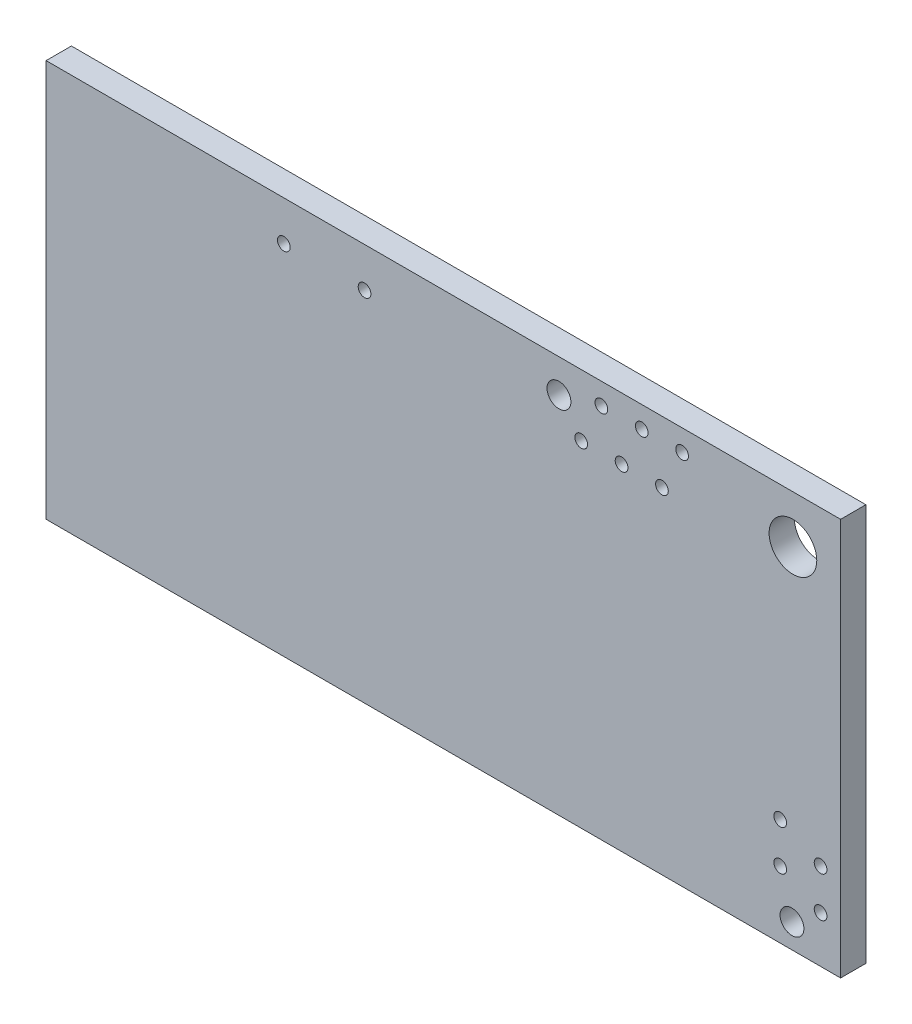
ISO-10303-21;
HEADER;
FILE_DESCRIPTION(('STEP AP214'),'2;1');
FILE_NAME('part.step','',(''),(''),'','','');
FILE_SCHEMA(('AUTOMOTIVE_DESIGN { 1 0 10303 214 1 1 1 1 }'));
ENDSEC;
DATA;
#1=APPLICATION_CONTEXT('core data for automotive mechanical design processes');
#2=APPLICATION_PROTOCOL_DEFINITION('international standard','automotive_design',2000,#1);
#3=PRODUCT_CONTEXT('',#1,'mechanical');
#4=PRODUCT('Part','Part','',(#3));
#5=PRODUCT_RELATED_PRODUCT_CATEGORY('part','',(#4));
#6=PRODUCT_DEFINITION_FORMATION('','',#4);
#7=PRODUCT_DEFINITION_CONTEXT('part definition',#1,'design');
#8=PRODUCT_DEFINITION('design','',#6,#7);
#9=PRODUCT_DEFINITION_SHAPE('','',#8);
#10=(LENGTH_UNIT() NAMED_UNIT(*) SI_UNIT(.MILLI.,.METRE.));
#11=(NAMED_UNIT(*) PLANE_ANGLE_UNIT() SI_UNIT($,.RADIAN.));
#12=(NAMED_UNIT(*) SI_UNIT($,.STERADIAN.) SOLID_ANGLE_UNIT());
#13=UNCERTAINTY_MEASURE_WITH_UNIT(LENGTH_MEASURE(1.E-05),#10,'distance_accuracy_value','');
#14=(GEOMETRIC_REPRESENTATION_CONTEXT(3) GLOBAL_UNCERTAINTY_ASSIGNED_CONTEXT((#13)) GLOBAL_UNIT_ASSIGNED_CONTEXT((#10,
#11,#12)) REPRESENTATION_CONTEXT('',''));
#15=CARTESIAN_POINT('',(0.,0.,0.));
#16=DIRECTION('',(0.,0.,1.));
#17=DIRECTION('',(1.,0.,0.));
#18=AXIS2_PLACEMENT_3D('',#15,#16,#17);
#19=CARTESIAN_POINT('',(0.,0.,-1.59143954));
#20=DIRECTION('',(0.,1.,0.));
#21=DIRECTION('',(1.,0.,0.));
#22=AXIS2_PLACEMENT_3D('',#19,#20,#21);
#23=PLANE('',#22);
#24=DIRECTION('',(1.,0.,0.));
#25=VECTOR('',#24,1.);
#26=CARTESIAN_POINT('',(0.,0.,-1.59143954));
#27=LINE('',#26,#25);
#28=CARTESIAN_POINT('',(0.,0.,-1.59143954));
#29=VERTEX_POINT('',#28);
#30=CARTESIAN_POINT('',(50.,0.,-1.59143954));
#31=VERTEX_POINT('',#30);
#32=EDGE_CURVE('E12',#29,#31,#27,.T.);
#33=ORIENTED_EDGE('',*,*,#32,.T.);
#34=DIRECTION('',(0.,0.,1.));
#35=VECTOR('',#34,1.);
#36=CARTESIAN_POINT('',(50.,0.,-1.59143954));
#37=LINE('',#36,#35);
#38=CARTESIAN_POINT('',(50.,0.,0.));
#39=VERTEX_POINT('',#38);
#40=EDGE_CURVE('E26',#31,#39,#37,.T.);
#41=ORIENTED_EDGE('',*,*,#40,.T.);
#42=DIRECTION('',(1.,0.,0.));
#43=VECTOR('',#42,1.);
#44=CARTESIAN_POINT('',(0.,0.,0.));
#45=LINE('',#44,#43);
#46=CARTESIAN_POINT('',(0.,0.,0.));
#47=VERTEX_POINT('',#46);
#48=EDGE_CURVE('E281',#47,#39,#45,.T.);
#49=ORIENTED_EDGE('',*,*,#48,.F.);
#50=DIRECTION('',(0.,0.,1.));
#51=VECTOR('',#50,1.);
#52=CARTESIAN_POINT('',(0.,0.,-1.59143954));
#53=LINE('',#52,#51);
#54=EDGE_CURVE('E38',#29,#47,#53,.T.);
#55=ORIENTED_EDGE('',*,*,#54,.F.);
#56=EDGE_LOOP('',(#33,#41,#49,#55));
#57=FACE_BOUND('',#56,.T.);
#58=ADVANCED_FACE('F17',(#57),#23,.F.);
#59=CARTESIAN_POINT('',(50.,0.,-1.59143954));
#60=DIRECTION('',(-1.,0.,0.));
#61=DIRECTION('',(0.,1.,0.));
#62=AXIS2_PLACEMENT_3D('',#59,#60,#61);
#63=PLANE('',#62);
#64=DIRECTION('',(0.,1.,0.));
#65=VECTOR('',#64,1.);
#66=CARTESIAN_POINT('',(50.,0.,-1.59143954));
#67=LINE('',#66,#65);
#68=CARTESIAN_POINT('',(50.,25.,-1.59143954));
#69=VERTEX_POINT('',#68);
#70=EDGE_CURVE('E278',#31,#69,#67,.T.);
#71=ORIENTED_EDGE('',*,*,#70,.T.);
#72=DIRECTION('',(0.,0.,1.));
#73=VECTOR('',#72,1.);
#74=CARTESIAN_POINT('',(50.,25.,-1.59143954));
#75=LINE('',#74,#73);
#76=CARTESIAN_POINT('',(50.,25.,0.));
#77=VERTEX_POINT('',#76);
#78=EDGE_CURVE('E275',#69,#77,#75,.T.);
#79=ORIENTED_EDGE('',*,*,#78,.T.);
#80=DIRECTION('',(0.,1.,0.));
#81=VECTOR('',#80,1.);
#82=CARTESIAN_POINT('',(50.,0.,0.));
#83=LINE('',#82,#81);
#84=EDGE_CURVE('E273',#39,#77,#83,.T.);
#85=ORIENTED_EDGE('',*,*,#84,.F.);
#86=ORIENTED_EDGE('',*,*,#40,.F.);
#87=EDGE_LOOP('',(#71,#79,#85,#86));
#88=FACE_BOUND('',#87,.T.);
#89=ADVANCED_FACE('F283',(#88),#63,.F.);
#90=CARTESIAN_POINT('',(50.,25.,-1.59143954));
#91=DIRECTION('',(0.,-1.,0.));
#92=DIRECTION('',(-1.,0.,0.));
#93=AXIS2_PLACEMENT_3D('',#90,#91,#92);
#94=PLANE('',#93);
#95=DIRECTION('',(-1.,0.,0.));
#96=VECTOR('',#95,1.);
#97=CARTESIAN_POINT('',(50.,25.,-1.59143954));
#98=LINE('',#97,#96);
#99=CARTESIAN_POINT('',(0.,25.,-1.59143954));
#100=VERTEX_POINT('',#99);
#101=EDGE_CURVE('E270',#69,#100,#98,.T.);
#102=ORIENTED_EDGE('',*,*,#101,.T.);
#103=DIRECTION('',(0.,0.,1.));
#104=VECTOR('',#103,1.);
#105=CARTESIAN_POINT('',(0.,25.,-1.59143954));
#106=LINE('',#105,#104);
#107=CARTESIAN_POINT('',(0.,25.,0.));
#108=VERTEX_POINT('',#107);
#109=EDGE_CURVE('E267',#100,#108,#106,.T.);
#110=ORIENTED_EDGE('',*,*,#109,.T.);
#111=DIRECTION('',(-1.,0.,0.));
#112=VECTOR('',#111,1.);
#113=CARTESIAN_POINT('',(50.,25.,0.));
#114=LINE('',#113,#112);
#115=EDGE_CURVE('E265',#77,#108,#114,.T.);
#116=ORIENTED_EDGE('',*,*,#115,.F.);
#117=ORIENTED_EDGE('',*,*,#78,.F.);
#118=EDGE_LOOP('',(#102,#110,#116,#117));
#119=FACE_BOUND('',#118,.T.);
#120=ADVANCED_FACE('F296',(#119),#94,.F.);
#121=CARTESIAN_POINT('',(0.,25.,-1.59143954));
#122=DIRECTION('',(1.,0.,0.));
#123=DIRECTION('',(0.,-1.,0.));
#124=AXIS2_PLACEMENT_3D('',#121,#122,#123);
#125=PLANE('',#124);
#126=DIRECTION('',(0.,-1.,0.));
#127=VECTOR('',#126,1.);
#128=CARTESIAN_POINT('',(0.,25.,-1.59143954));
#129=LINE('',#128,#127);
#130=EDGE_CURVE('E262',#100,#29,#129,.T.);
#131=ORIENTED_EDGE('',*,*,#130,.T.);
#132=ORIENTED_EDGE('',*,*,#54,.T.);
#133=DIRECTION('',(0.,-1.,0.));
#134=VECTOR('',#133,1.);
#135=CARTESIAN_POINT('',(0.,25.,0.));
#136=LINE('',#135,#134);
#137=EDGE_CURVE('E259',#108,#47,#136,.T.);
#138=ORIENTED_EDGE('',*,*,#137,.F.);
#139=ORIENTED_EDGE('',*,*,#109,.F.);
#140=EDGE_LOOP('',(#131,#132,#138,#139));
#141=FACE_BOUND('',#140,.T.);
#142=ADVANCED_FACE('F290',(#141),#125,.F.);
#143=CARTESIAN_POINT('',(20.03999802,22.49999818,-1.59143954));
#144=DIRECTION('',(0.,0.,-1.));
#145=DIRECTION('',(1.,0.,0.));
#146=AXIS2_PLACEMENT_3D('',#143,#144,#145);
#147=CYLINDRICAL_SURFACE('',#146,0.3999992);
#148=DIRECTION('',(0.,0.,1.));
#149=VECTOR('',#148,1.);
#150=CARTESIAN_POINT('',(20.43999722,22.49999818,-1.59143954));
#151=LINE('',#150,#149);
#152=CARTESIAN_POINT('',(20.43999722,22.49999818,-1.59143954));
#153=VERTEX_POINT('',#152);
#154=CARTESIAN_POINT('',(20.43999722,22.49999818,0.));
#155=VERTEX_POINT('',#154);
#156=EDGE_CURVE('E257',#153,#155,#151,.T.);
#157=ORIENTED_EDGE('',*,*,#156,.T.);
#158=CARTESIAN_POINT('',(20.03999802,22.49999818,0.));
#159=DIRECTION('',(0.,0.,1.));
#160=DIRECTION('',(1.,0.,0.));
#161=AXIS2_PLACEMENT_3D('',#158,#159,#160);
#162=CIRCLE('',#161,0.3999992);
#163=EDGE_CURVE('E254',#155,#155,#162,.T.);
#164=ORIENTED_EDGE('',*,*,#163,.T.);
#165=ORIENTED_EDGE('',*,*,#156,.F.);
#166=CARTESIAN_POINT('',(20.03999802,22.49999818,-1.59143954));
#167=DIRECTION('',(0.,0.,1.));
#168=DIRECTION('',(1.,0.,0.));
#169=AXIS2_PLACEMENT_3D('',#166,#167,#168);
#170=CIRCLE('',#169,0.3999992);
#171=EDGE_CURVE('E252',#153,#153,#170,.T.);
#172=ORIENTED_EDGE('',*,*,#171,.F.);
#173=EDGE_LOOP('',(#157,#164,#165,#172));
#174=FACE_BOUND('',#173,.T.);
#175=ADVANCED_FACE('F304',(#174),#147,.F.);
#176=CARTESIAN_POINT('',(36.21522348,21.11000096,-1.59143954));
#177=DIRECTION('',(0.,0.,-1.));
#178=DIRECTION('',(1.,0.,0.));
#179=AXIS2_PLACEMENT_3D('',#176,#177,#178);
#180=CYLINDRICAL_SURFACE('',#179,0.3999992);
#181=DIRECTION('',(0.,0.,1.));
#182=VECTOR('',#181,1.);
#183=CARTESIAN_POINT('',(36.61522268,21.11000096,-1.59143954));
#184=LINE('',#183,#182);
#185=CARTESIAN_POINT('',(36.61522268,21.11000096,-1.59143954));
#186=VERTEX_POINT('',#185);
#187=CARTESIAN_POINT('',(36.61522268,21.11000096,0.));
#188=VERTEX_POINT('',#187);
#189=EDGE_CURVE('E250',#186,#188,#184,.T.);
#190=ORIENTED_EDGE('',*,*,#189,.T.);
#191=CARTESIAN_POINT('',(36.21522348,21.11000096,0.));
#192=DIRECTION('',(0.,0.,1.));
#193=DIRECTION('',(1.,0.,0.));
#194=AXIS2_PLACEMENT_3D('',#191,#192,#193);
#195=CIRCLE('',#194,0.3999992);
#196=EDGE_CURVE('E247',#188,#188,#195,.T.);
#197=ORIENTED_EDGE('',*,*,#196,.T.);
#198=ORIENTED_EDGE('',*,*,#189,.F.);
#199=CARTESIAN_POINT('',(36.21522348,21.11000096,-1.59143954));
#200=DIRECTION('',(0.,0.,1.));
#201=DIRECTION('',(1.,0.,0.));
#202=AXIS2_PLACEMENT_3D('',#199,#200,#201);
#203=CIRCLE('',#202,0.3999992);
#204=EDGE_CURVE('E245',#186,#186,#203,.T.);
#205=ORIENTED_EDGE('',*,*,#204,.F.);
#206=EDGE_LOOP('',(#190,#197,#198,#205));
#207=FACE_BOUND('',#206,.T.);
#208=ADVANCED_FACE('F337',(#207),#180,.F.);
#209=CARTESIAN_POINT('',(33.67522348,21.11000096,-1.59143954));
#210=DIRECTION('',(0.,0.,-1.));
#211=DIRECTION('',(1.,0.,0.));
#212=AXIS2_PLACEMENT_3D('',#209,#210,#211);
#213=CYLINDRICAL_SURFACE('',#212,0.3999992);
#214=DIRECTION('',(0.,0.,1.));
#215=VECTOR('',#214,1.);
#216=CARTESIAN_POINT('',(34.07522268,21.11000096,-1.59143954));
#217=LINE('',#216,#215);
#218=CARTESIAN_POINT('',(34.07522268,21.11000096,-1.59143954));
#219=VERTEX_POINT('',#218);
#220=CARTESIAN_POINT('',(34.07522268,21.11000096,0.));
#221=VERTEX_POINT('',#220);
#222=EDGE_CURVE('E243',#219,#221,#217,.T.);
#223=ORIENTED_EDGE('',*,*,#222,.T.);
#224=CARTESIAN_POINT('',(33.67522348,21.11000096,0.));
#225=DIRECTION('',(0.,0.,1.));
#226=DIRECTION('',(1.,0.,0.));
#227=AXIS2_PLACEMENT_3D('',#224,#225,#226);
#228=CIRCLE('',#227,0.3999992);
#229=EDGE_CURVE('E240',#221,#221,#228,.T.);
#230=ORIENTED_EDGE('',*,*,#229,.T.);
#231=ORIENTED_EDGE('',*,*,#222,.F.);
#232=CARTESIAN_POINT('',(33.67522348,21.11000096,-1.59143954));
#233=DIRECTION('',(0.,0.,1.));
#234=DIRECTION('',(1.,0.,0.));
#235=AXIS2_PLACEMENT_3D('',#232,#233,#234);
#236=CIRCLE('',#235,0.3999992);
#237=EDGE_CURVE('E238',#219,#219,#236,.T.);
#238=ORIENTED_EDGE('',*,*,#237,.F.);
#239=EDGE_LOOP('',(#223,#230,#231,#238));
#240=FACE_BOUND('',#239,.T.);
#241=ADVANCED_FACE('F347',(#240),#213,.F.);
#242=CARTESIAN_POINT('',(14.95999802,22.49999818,-1.59143954));
#243=DIRECTION('',(0.,0.,-1.));
#244=DIRECTION('',(1.,0.,0.));
#245=AXIS2_PLACEMENT_3D('',#242,#243,#244);
#246=CYLINDRICAL_SURFACE('',#245,0.3999992);
#247=DIRECTION('',(0.,0.,1.));
#248=VECTOR('',#247,1.);
#249=CARTESIAN_POINT('',(15.35999722,22.49999818,-1.59143954));
#250=LINE('',#249,#248);
#251=CARTESIAN_POINT('',(15.35999722,22.49999818,-1.59143954));
#252=VERTEX_POINT('',#251);
#253=CARTESIAN_POINT('',(15.35999722,22.49999818,0.));
#254=VERTEX_POINT('',#253);
#255=EDGE_CURVE('E236',#252,#254,#250,.T.);
#256=ORIENTED_EDGE('',*,*,#255,.T.);
#257=CARTESIAN_POINT('',(14.95999802,22.49999818,0.));
#258=DIRECTION('',(0.,0.,1.));
#259=DIRECTION('',(1.,0.,0.));
#260=AXIS2_PLACEMENT_3D('',#257,#258,#259);
#261=CIRCLE('',#260,0.3999992);
#262=EDGE_CURVE('E233',#254,#254,#261,.T.);
#263=ORIENTED_EDGE('',*,*,#262,.T.);
#264=ORIENTED_EDGE('',*,*,#255,.F.);
#265=CARTESIAN_POINT('',(14.95999802,22.49999818,-1.59143954));
#266=DIRECTION('',(0.,0.,1.));
#267=DIRECTION('',(1.,0.,0.));
#268=AXIS2_PLACEMENT_3D('',#265,#266,#267);
#269=CIRCLE('',#268,0.3999992);
#270=EDGE_CURVE('E231',#252,#252,#269,.T.);
#271=ORIENTED_EDGE('',*,*,#270,.F.);
#272=EDGE_LOOP('',(#256,#263,#264,#271));
#273=FACE_BOUND('',#272,.T.);
#274=ADVANCED_FACE('F357',(#273),#246,.F.);
#275=CARTESIAN_POINT('',(32.27522374,22.9099999,-1.59143954));
#276=DIRECTION('',(0.,0.,-1.));
#277=DIRECTION('',(1.,0.,0.));
#278=AXIS2_PLACEMENT_3D('',#275,#276,#277);
#279=CYLINDRICAL_SURFACE('',#278,0.7499985);
#280=DIRECTION('',(0.,0.,1.));
#281=VECTOR('',#280,1.);
#282=CARTESIAN_POINT('',(33.02522224,22.9099999,-1.59143954));
#283=LINE('',#282,#281);
#284=CARTESIAN_POINT('',(33.02522224,22.9099999,-1.59143954));
#285=VERTEX_POINT('',#284);
#286=CARTESIAN_POINT('',(33.02522224,22.9099999,0.));
#287=VERTEX_POINT('',#286);
#288=EDGE_CURVE('E229',#285,#287,#283,.T.);
#289=ORIENTED_EDGE('',*,*,#288,.T.);
#290=CARTESIAN_POINT('',(32.27522374,22.9099999,0.));
#291=DIRECTION('',(0.,0.,1.));
#292=DIRECTION('',(1.,0.,0.));
#293=AXIS2_PLACEMENT_3D('',#290,#291,#292);
#294=CIRCLE('',#293,0.7499985);
#295=EDGE_CURVE('E226',#287,#287,#294,.T.);
#296=ORIENTED_EDGE('',*,*,#295,.T.);
#297=ORIENTED_EDGE('',*,*,#288,.F.);
#298=CARTESIAN_POINT('',(32.27522374,22.9099999,-1.59143954));
#299=DIRECTION('',(0.,0.,1.));
#300=DIRECTION('',(1.,0.,0.));
#301=AXIS2_PLACEMENT_3D('',#298,#299,#300);
#302=CIRCLE('',#301,0.7499985);
#303=EDGE_CURVE('E224',#285,#285,#302,.T.);
#304=ORIENTED_EDGE('',*,*,#303,.F.);
#305=EDGE_LOOP('',(#289,#296,#297,#304));
#306=FACE_BOUND('',#305,.T.);
#307=ADVANCED_FACE('F367',(#306),#279,.F.);
#308=CARTESIAN_POINT('',(37.48522348,23.65000096,-1.59143954));
#309=DIRECTION('',(0.,0.,-1.));
#310=DIRECTION('',(1.,0.,0.));
#311=AXIS2_PLACEMENT_3D('',#308,#309,#310);
#312=CYLINDRICAL_SURFACE('',#311,0.3999992);
#313=DIRECTION('',(0.,0.,1.));
#314=VECTOR('',#313,1.);
#315=CARTESIAN_POINT('',(37.88522268,23.65000096,-1.59143954));
#316=LINE('',#315,#314);
#317=CARTESIAN_POINT('',(37.88522268,23.65000096,-1.59143954));
#318=VERTEX_POINT('',#317);
#319=CARTESIAN_POINT('',(37.88522268,23.65000096,0.));
#320=VERTEX_POINT('',#319);
#321=EDGE_CURVE('E222',#318,#320,#316,.T.);
#322=ORIENTED_EDGE('',*,*,#321,.T.);
#323=CARTESIAN_POINT('',(37.48522348,23.65000096,0.));
#324=DIRECTION('',(0.,0.,1.));
#325=DIRECTION('',(1.,0.,0.));
#326=AXIS2_PLACEMENT_3D('',#323,#324,#325);
#327=CIRCLE('',#326,0.3999992);
#328=EDGE_CURVE('E219',#320,#320,#327,.T.);
#329=ORIENTED_EDGE('',*,*,#328,.T.);
#330=ORIENTED_EDGE('',*,*,#321,.F.);
#331=CARTESIAN_POINT('',(37.48522348,23.65000096,-1.59143954));
#332=DIRECTION('',(0.,0.,1.));
#333=DIRECTION('',(1.,0.,0.));
#334=AXIS2_PLACEMENT_3D('',#331,#332,#333);
#335=CIRCLE('',#334,0.3999992);
#336=EDGE_CURVE('E216',#318,#318,#335,.T.);
#337=ORIENTED_EDGE('',*,*,#336,.F.);
#338=EDGE_LOOP('',(#322,#329,#330,#337));
#339=FACE_BOUND('',#338,.T.);
#340=ADVANCED_FACE('F377',(#339),#312,.F.);
#341=CARTESIAN_POINT('',(34.94522348,23.65000096,-1.59143954));
#342=DIRECTION('',(0.,0.,-1.));
#343=DIRECTION('',(1.,0.,0.));
#344=AXIS2_PLACEMENT_3D('',#341,#342,#343);
#345=CYLINDRICAL_SURFACE('',#344,0.3999992);
#346=DIRECTION('',(0.,0.,1.));
#347=VECTOR('',#346,1.);
#348=CARTESIAN_POINT('',(35.34522268,23.65000096,-1.59143954));
#349=LINE('',#348,#347);
#350=CARTESIAN_POINT('',(35.34522268,23.65000096,-1.59143954));
#351=VERTEX_POINT('',#350);
#352=CARTESIAN_POINT('',(35.34522268,23.65000096,0.));
#353=VERTEX_POINT('',#352);
#354=EDGE_CURVE('E214',#351,#353,#349,.T.);
#355=ORIENTED_EDGE('',*,*,#354,.T.);
#356=CARTESIAN_POINT('',(34.94522348,23.65000096,0.));
#357=DIRECTION('',(0.,0.,1.));
#358=DIRECTION('',(1.,0.,0.));
#359=AXIS2_PLACEMENT_3D('',#356,#357,#358);
#360=CIRCLE('',#359,0.3999992);
#361=EDGE_CURVE('E211',#353,#353,#360,.T.);
#362=ORIENTED_EDGE('',*,*,#361,.T.);
#363=ORIENTED_EDGE('',*,*,#354,.F.);
#364=CARTESIAN_POINT('',(34.94522348,23.65000096,-1.59143954));
#365=DIRECTION('',(0.,0.,1.));
#366=DIRECTION('',(1.,0.,0.));
#367=AXIS2_PLACEMENT_3D('',#364,#365,#366);
#368=CIRCLE('',#367,0.3999992);
#369=EDGE_CURVE('E209',#351,#351,#368,.T.);
#370=ORIENTED_EDGE('',*,*,#369,.F.);
#371=EDGE_LOOP('',(#355,#362,#363,#370));
#372=FACE_BOUND('',#371,.T.);
#373=ADVANCED_FACE('F387',(#372),#345,.F.);
#374=CARTESIAN_POINT('',(46.9400001,1.52999948,-1.59143954));
#375=DIRECTION('',(0.,0.,-1.));
#376=DIRECTION('',(1.,0.,0.));
#377=AXIS2_PLACEMENT_3D('',#374,#375,#376);
#378=CYLINDRICAL_SURFACE('',#377,0.7499985);
#379=DIRECTION('',(0.,0.,1.));
#380=VECTOR('',#379,1.);
#381=CARTESIAN_POINT('',(47.6899986,1.52999948,-1.59143954));
#382=LINE('',#381,#380);
#383=CARTESIAN_POINT('',(47.6899986,1.52999948,-1.59143954));
#384=VERTEX_POINT('',#383);
#385=CARTESIAN_POINT('',(47.6899986,1.52999948,0.));
#386=VERTEX_POINT('',#385);
#387=EDGE_CURVE('E207',#384,#386,#382,.T.);
#388=ORIENTED_EDGE('',*,*,#387,.T.);
#389=CARTESIAN_POINT('',(46.9400001,1.52999948,0.));
#390=DIRECTION('',(0.,0.,1.));
#391=DIRECTION('',(1.,0.,0.));
#392=AXIS2_PLACEMENT_3D('',#389,#390,#391);
#393=CIRCLE('',#392,0.7499985);
#394=EDGE_CURVE('E204',#386,#386,#393,.T.);
#395=ORIENTED_EDGE('',*,*,#394,.T.);
#396=ORIENTED_EDGE('',*,*,#387,.F.);
#397=CARTESIAN_POINT('',(46.9400001,1.52999948,-1.59143954));
#398=DIRECTION('',(0.,0.,1.));
#399=DIRECTION('',(1.,0.,0.));
#400=AXIS2_PLACEMENT_3D('',#397,#398,#399);
#401=CIRCLE('',#400,0.7499985);
#402=EDGE_CURVE('E202',#384,#384,#401,.T.);
#403=ORIENTED_EDGE('',*,*,#402,.F.);
#404=EDGE_LOOP('',(#388,#395,#396,#403));
#405=FACE_BOUND('',#404,.T.);
#406=ADVANCED_FACE('F397',(#405),#378,.F.);
#407=CARTESIAN_POINT('',(46.19999904,4.19999922,-1.59143954));
#408=DIRECTION('',(0.,0.,-1.));
#409=DIRECTION('',(1.,0.,0.));
#410=AXIS2_PLACEMENT_3D('',#407,#408,#409);
#411=CYLINDRICAL_SURFACE('',#410,0.3999992);
#412=DIRECTION('',(0.,0.,1.));
#413=VECTOR('',#412,1.);
#414=CARTESIAN_POINT('',(46.59999824,4.19999922,-1.59143954));
#415=LINE('',#414,#413);
#416=CARTESIAN_POINT('',(46.59999824,4.19999922,-1.59143954));
#417=VERTEX_POINT('',#416);
#418=CARTESIAN_POINT('',(46.59999824,4.19999922,0.));
#419=VERTEX_POINT('',#418);
#420=EDGE_CURVE('E200',#417,#419,#415,.T.);
#421=ORIENTED_EDGE('',*,*,#420,.T.);
#422=CARTESIAN_POINT('',(46.19999904,4.19999922,0.));
#423=DIRECTION('',(0.,0.,1.));
#424=DIRECTION('',(1.,0.,0.));
#425=AXIS2_PLACEMENT_3D('',#422,#423,#424);
#426=CIRCLE('',#425,0.3999992);
#427=EDGE_CURVE('E197',#419,#419,#426,.T.);
#428=ORIENTED_EDGE('',*,*,#427,.T.);
#429=ORIENTED_EDGE('',*,*,#420,.F.);
#430=CARTESIAN_POINT('',(46.19999904,4.19999922,-1.59143954));
#431=DIRECTION('',(0.,0.,1.));
#432=DIRECTION('',(1.,0.,0.));
#433=AXIS2_PLACEMENT_3D('',#430,#431,#432);
#434=CIRCLE('',#433,0.3999992);
#435=EDGE_CURVE('E195',#417,#417,#434,.T.);
#436=ORIENTED_EDGE('',*,*,#435,.F.);
#437=EDGE_LOOP('',(#421,#428,#429,#436));
#438=FACE_BOUND('',#437,.T.);
#439=ADVANCED_FACE('F407',(#438),#411,.F.);
#440=CARTESIAN_POINT('',(48.73999904,2.92999922,-1.59143954));
#441=DIRECTION('',(0.,0.,-1.));
#442=DIRECTION('',(1.,0.,0.));
#443=AXIS2_PLACEMENT_3D('',#440,#441,#442);
#444=CYLINDRICAL_SURFACE('',#443,0.3999992);
#445=DIRECTION('',(0.,0.,1.));
#446=VECTOR('',#445,1.);
#447=CARTESIAN_POINT('',(49.13999824,2.92999922,-1.59143954));
#448=LINE('',#447,#446);
#449=CARTESIAN_POINT('',(49.13999824,2.92999922,-1.59143954));
#450=VERTEX_POINT('',#449);
#451=CARTESIAN_POINT('',(49.13999824,2.92999922,0.));
#452=VERTEX_POINT('',#451);
#453=EDGE_CURVE('E193',#450,#452,#448,.T.);
#454=ORIENTED_EDGE('',*,*,#453,.T.);
#455=CARTESIAN_POINT('',(48.73999904,2.92999922,0.));
#456=DIRECTION('',(0.,0.,1.));
#457=DIRECTION('',(1.,0.,0.));
#458=AXIS2_PLACEMENT_3D('',#455,#456,#457);
#459=CIRCLE('',#458,0.3999992);
#460=EDGE_CURVE('E190',#452,#452,#459,.T.);
#461=ORIENTED_EDGE('',*,*,#460,.T.);
#462=ORIENTED_EDGE('',*,*,#453,.F.);
#463=CARTESIAN_POINT('',(48.73999904,2.92999922,-1.59143954));
#464=DIRECTION('',(0.,0.,1.));
#465=DIRECTION('',(1.,0.,0.));
#466=AXIS2_PLACEMENT_3D('',#463,#464,#465);
#467=CIRCLE('',#466,0.3999992);
#468=EDGE_CURVE('E188',#450,#450,#467,.T.);
#469=ORIENTED_EDGE('',*,*,#468,.F.);
#470=EDGE_LOOP('',(#454,#461,#462,#469));
#471=FACE_BOUND('',#470,.T.);
#472=ADVANCED_FACE('F417',(#471),#444,.F.);
#473=CARTESIAN_POINT('',(48.73999904,5.46999922,-1.59143954));
#474=DIRECTION('',(0.,0.,-1.));
#475=DIRECTION('',(1.,0.,0.));
#476=AXIS2_PLACEMENT_3D('',#473,#474,#475);
#477=CYLINDRICAL_SURFACE('',#476,0.3999992);
#478=DIRECTION('',(0.,0.,1.));
#479=VECTOR('',#478,1.);
#480=CARTESIAN_POINT('',(49.13999824,5.46999922,-1.59143954));
#481=LINE('',#480,#479);
#482=CARTESIAN_POINT('',(49.13999824,5.46999922,-1.59143954));
#483=VERTEX_POINT('',#482);
#484=CARTESIAN_POINT('',(49.13999824,5.46999922,0.));
#485=VERTEX_POINT('',#484);
#486=EDGE_CURVE('E186',#483,#485,#481,.T.);
#487=ORIENTED_EDGE('',*,*,#486,.T.);
#488=CARTESIAN_POINT('',(48.73999904,5.46999922,0.));
#489=DIRECTION('',(0.,0.,1.));
#490=DIRECTION('',(1.,0.,0.));
#491=AXIS2_PLACEMENT_3D('',#488,#489,#490);
#492=CIRCLE('',#491,0.3999992);
#493=EDGE_CURVE('E183',#485,#485,#492,.T.);
#494=ORIENTED_EDGE('',*,*,#493,.T.);
#495=ORIENTED_EDGE('',*,*,#486,.F.);
#496=CARTESIAN_POINT('',(48.73999904,5.46999922,-1.59143954));
#497=DIRECTION('',(0.,0.,1.));
#498=DIRECTION('',(1.,0.,0.));
#499=AXIS2_PLACEMENT_3D('',#496,#497,#498);
#500=CIRCLE('',#499,0.3999992);
#501=EDGE_CURVE('E181',#483,#483,#500,.T.);
#502=ORIENTED_EDGE('',*,*,#501,.F.);
#503=EDGE_LOOP('',(#487,#494,#495,#502));
#504=FACE_BOUND('',#503,.T.);
#505=ADVANCED_FACE('F427',(#504),#477,.F.);
#506=CARTESIAN_POINT('',(38.75522348,21.11000096,-1.59143954));
#507=DIRECTION('',(0.,0.,-1.));
#508=DIRECTION('',(1.,0.,0.));
#509=AXIS2_PLACEMENT_3D('',#506,#507,#508);
#510=CYLINDRICAL_SURFACE('',#509,0.3999992);
#511=DIRECTION('',(0.,0.,1.));
#512=VECTOR('',#511,1.);
#513=CARTESIAN_POINT('',(39.15522268,21.11000096,-1.59143954));
#514=LINE('',#513,#512);
#515=CARTESIAN_POINT('',(39.15522268,21.11000096,-1.59143954));
#516=VERTEX_POINT('',#515);
#517=CARTESIAN_POINT('',(39.15522268,21.11000096,0.));
#518=VERTEX_POINT('',#517);
#519=EDGE_CURVE('E179',#516,#518,#514,.T.);
#520=ORIENTED_EDGE('',*,*,#519,.T.);
#521=CARTESIAN_POINT('',(38.75522348,21.11000096,0.));
#522=DIRECTION('',(0.,0.,1.));
#523=DIRECTION('',(1.,0.,0.));
#524=AXIS2_PLACEMENT_3D('',#521,#522,#523);
#525=CIRCLE('',#524,0.3999992);
#526=EDGE_CURVE('E176',#518,#518,#525,.T.);
#527=ORIENTED_EDGE('',*,*,#526,.T.);
#528=ORIENTED_EDGE('',*,*,#519,.F.);
#529=CARTESIAN_POINT('',(38.75522348,21.11000096,-1.59143954));
#530=DIRECTION('',(0.,0.,1.));
#531=DIRECTION('',(1.,0.,0.));
#532=AXIS2_PLACEMENT_3D('',#529,#530,#531);
#533=CIRCLE('',#532,0.3999992);
#534=EDGE_CURVE('E174',#516,#516,#533,.T.);
#535=ORIENTED_EDGE('',*,*,#534,.F.);
#536=EDGE_LOOP('',(#520,#527,#528,#535));
#537=FACE_BOUND('',#536,.T.);
#538=ADVANCED_FACE('F437',(#537),#510,.F.);
#539=CARTESIAN_POINT('',(40.02522348,23.65000096,-1.59143954));
#540=DIRECTION('',(0.,0.,-1.));
#541=DIRECTION('',(1.,0.,0.));
#542=AXIS2_PLACEMENT_3D('',#539,#540,#541);
#543=CYLINDRICAL_SURFACE('',#542,0.3999992);
#544=DIRECTION('',(0.,0.,1.));
#545=VECTOR('',#544,1.);
#546=CARTESIAN_POINT('',(40.42522268,23.65000096,-1.59143954));
#547=LINE('',#546,#545);
#548=CARTESIAN_POINT('',(40.42522268,23.65000096,-1.59143954));
#549=VERTEX_POINT('',#548);
#550=CARTESIAN_POINT('',(40.42522268,23.65000096,0.));
#551=VERTEX_POINT('',#550);
#552=EDGE_CURVE('E172',#549,#551,#547,.T.);
#553=ORIENTED_EDGE('',*,*,#552,.T.);
#554=CARTESIAN_POINT('',(40.02522348,23.65000096,0.));
#555=DIRECTION('',(0.,0.,1.));
#556=DIRECTION('',(1.,0.,0.));
#557=AXIS2_PLACEMENT_3D('',#554,#555,#556);
#558=CIRCLE('',#557,0.3999992);
#559=EDGE_CURVE('E169',#551,#551,#558,.T.);
#560=ORIENTED_EDGE('',*,*,#559,.T.);
#561=ORIENTED_EDGE('',*,*,#552,.F.);
#562=CARTESIAN_POINT('',(40.02522348,23.65000096,-1.59143954));
#563=DIRECTION('',(0.,0.,1.));
#564=DIRECTION('',(1.,0.,0.));
#565=AXIS2_PLACEMENT_3D('',#562,#563,#564);
#566=CIRCLE('',#565,0.3999992);
#567=EDGE_CURVE('E166',#549,#549,#566,.T.);
#568=ORIENTED_EDGE('',*,*,#567,.F.);
#569=EDGE_LOOP('',(#553,#560,#561,#568));
#570=FACE_BOUND('',#569,.T.);
#571=ADVANCED_FACE('F447',(#570),#543,.F.);
#572=CARTESIAN_POINT('',(46.19999904,6.73999922,-1.59143954));
#573=DIRECTION('',(0.,0.,-1.));
#574=DIRECTION('',(1.,0.,0.));
#575=AXIS2_PLACEMENT_3D('',#572,#573,#574);
#576=CYLINDRICAL_SURFACE('',#575,0.3999992);
#577=DIRECTION('',(0.,0.,1.));
#578=VECTOR('',#577,1.);
#579=CARTESIAN_POINT('',(46.59999824,6.73999922,-1.59143954));
#580=LINE('',#579,#578);
#581=CARTESIAN_POINT('',(46.59999824,6.73999922,-1.59143954));
#582=VERTEX_POINT('',#581);
#583=CARTESIAN_POINT('',(46.59999824,6.73999922,0.));
#584=VERTEX_POINT('',#583);
#585=EDGE_CURVE('E163',#582,#584,#580,.T.);
#586=ORIENTED_EDGE('',*,*,#585,.T.);
#587=CARTESIAN_POINT('',(46.19999904,6.73999922,0.));
#588=DIRECTION('',(0.,0.,1.));
#589=DIRECTION('',(1.,0.,0.));
#590=AXIS2_PLACEMENT_3D('',#587,#588,#589);
#591=CIRCLE('',#590,0.3999992);
#592=EDGE_CURVE('E161',#584,#584,#591,.T.);
#593=ORIENTED_EDGE('',*,*,#592,.T.);
#594=ORIENTED_EDGE('',*,*,#585,.F.);
#595=CARTESIAN_POINT('',(46.19999904,6.73999922,-1.59143954));
#596=DIRECTION('',(0.,0.,1.));
#597=DIRECTION('',(1.,0.,0.));
#598=AXIS2_PLACEMENT_3D('',#595,#596,#597);
#599=CIRCLE('',#598,0.3999992);
#600=EDGE_CURVE('E159',#582,#582,#599,.T.);
#601=ORIENTED_EDGE('',*,*,#600,.F.);
#602=EDGE_LOOP('',(#586,#593,#594,#601));
#603=FACE_BOUND('',#602,.T.);
#604=ADVANCED_FACE('F457',(#603),#576,.F.);
#605=CARTESIAN_POINT('',(46.99999998,22.00000172,-1.59143954));
#606=DIRECTION('',(0.,0.,-1.));
#607=DIRECTION('',(1.,0.,0.));
#608=AXIS2_PLACEMENT_3D('',#605,#606,#607);
#609=CYLINDRICAL_SURFACE('',#608,1.49999954);
#610=DIRECTION('',(0.,0.,1.));
#611=VECTOR('',#610,1.);
#612=CARTESIAN_POINT('',(48.49999952,22.00000172,-1.59143954));
#613=LINE('',#612,#611);
#614=CARTESIAN_POINT('',(48.49999952,22.00000172,-1.59143954));
#615=VERTEX_POINT('',#614);
#616=CARTESIAN_POINT('',(48.49999952,22.00000172,0.));
#617=VERTEX_POINT('',#616);
#618=EDGE_CURVE('E155',#615,#617,#613,.T.);
#619=ORIENTED_EDGE('',*,*,#618,.T.);
#620=CARTESIAN_POINT('',(46.99999998,22.00000172,0.));
#621=DIRECTION('',(0.,0.,1.));
#622=DIRECTION('',(1.,0.,0.));
#623=AXIS2_PLACEMENT_3D('',#620,#621,#622);
#624=CIRCLE('',#623,1.49999954);
#625=EDGE_CURVE('E152',#617,#617,#624,.T.);
#626=ORIENTED_EDGE('',*,*,#625,.T.);
#627=ORIENTED_EDGE('',*,*,#618,.F.);
#628=CARTESIAN_POINT('',(46.99999998,22.00000172,-1.59143954));
#629=DIRECTION('',(0.,0.,1.));
#630=DIRECTION('',(1.,0.,0.));
#631=AXIS2_PLACEMENT_3D('',#628,#629,#630);
#632=CIRCLE('',#631,1.49999954);
#633=EDGE_CURVE('E148',#615,#615,#632,.T.);
#634=ORIENTED_EDGE('',*,*,#633,.F.);
#635=EDGE_LOOP('',(#619,#626,#627,#634));
#636=FACE_BOUND('',#635,.T.);
#637=ADVANCED_FACE('F467',(#636),#609,.F.);
#638=CARTESIAN_POINT('',(0.,0.,-1.59143954));
#639=DIRECTION('',(0.,0.,-1.));
#640=DIRECTION('',(-1.,0.,0.));
#641=AXIS2_PLACEMENT_3D('',#638,#639,#640);
#642=PLANE('',#641);
#643=ORIENTED_EDGE('',*,*,#130,.F.);
#644=ORIENTED_EDGE('',*,*,#101,.F.);
#645=ORIENTED_EDGE('',*,*,#70,.F.);
#646=ORIENTED_EDGE('',*,*,#32,.F.);
#647=EDGE_LOOP('',(#643,#644,#645,#646));
#648=FACE_BOUND('',#647,.T.);
#649=ORIENTED_EDGE('',*,*,#171,.T.);
#650=EDGE_LOOP('',(#649));
#651=FACE_BOUND('',#650,.T.);
#652=ORIENTED_EDGE('',*,*,#204,.T.);
#653=EDGE_LOOP('',(#652));
#654=FACE_BOUND('',#653,.T.);
#655=ORIENTED_EDGE('',*,*,#237,.T.);
#656=EDGE_LOOP('',(#655));
#657=FACE_BOUND('',#656,.T.);
#658=ORIENTED_EDGE('',*,*,#270,.T.);
#659=EDGE_LOOP('',(#658));
#660=FACE_BOUND('',#659,.T.);
#661=ORIENTED_EDGE('',*,*,#303,.T.);
#662=EDGE_LOOP('',(#661));
#663=FACE_BOUND('',#662,.T.);
#664=ORIENTED_EDGE('',*,*,#336,.T.);
#665=EDGE_LOOP('',(#664));
#666=FACE_BOUND('',#665,.T.);
#667=ORIENTED_EDGE('',*,*,#369,.T.);
#668=EDGE_LOOP('',(#667));
#669=FACE_BOUND('',#668,.T.);
#670=ORIENTED_EDGE('',*,*,#402,.T.);
#671=EDGE_LOOP('',(#670));
#672=FACE_BOUND('',#671,.T.);
#673=ORIENTED_EDGE('',*,*,#435,.T.);
#674=EDGE_LOOP('',(#673));
#675=FACE_BOUND('',#674,.T.);
#676=ORIENTED_EDGE('',*,*,#468,.T.);
#677=EDGE_LOOP('',(#676));
#678=FACE_BOUND('',#677,.T.);
#679=ORIENTED_EDGE('',*,*,#501,.T.);
#680=EDGE_LOOP('',(#679));
#681=FACE_BOUND('',#680,.T.);
#682=ORIENTED_EDGE('',*,*,#534,.T.);
#683=EDGE_LOOP('',(#682));
#684=FACE_BOUND('',#683,.T.);
#685=ORIENTED_EDGE('',*,*,#567,.T.);
#686=EDGE_LOOP('',(#685));
#687=FACE_BOUND('',#686,.T.);
#688=ORIENTED_EDGE('',*,*,#600,.T.);
#689=EDGE_LOOP('',(#688));
#690=FACE_BOUND('',#689,.T.);
#691=ORIENTED_EDGE('',*,*,#633,.T.);
#692=EDGE_LOOP('',(#691));
#693=FACE_BOUND('',#692,.T.);
#694=ADVANCED_FACE('F149',(#648,#651,#654,#657,#660,#663,#666,#669,#672,#675,#678,#681,#684,
#687,#690,#693),#642,.T.);
#695=CARTESIAN_POINT('',(0.,0.,0.));
#696=DIRECTION('',(0.,0.,-1.));
#697=DIRECTION('',(-1.,0.,0.));
#698=AXIS2_PLACEMENT_3D('',#695,#696,#697);
#699=PLANE('',#698);
#700=ORIENTED_EDGE('',*,*,#48,.T.);
#701=ORIENTED_EDGE('',*,*,#84,.T.);
#702=ORIENTED_EDGE('',*,*,#115,.T.);
#703=ORIENTED_EDGE('',*,*,#137,.T.);
#704=EDGE_LOOP('',(#700,#701,#702,#703));
#705=FACE_BOUND('',#704,.T.);
#706=ORIENTED_EDGE('',*,*,#163,.F.);
#707=EDGE_LOOP('',(#706));
#708=FACE_BOUND('',#707,.T.);
#709=ORIENTED_EDGE('',*,*,#196,.F.);
#710=EDGE_LOOP('',(#709));
#711=FACE_BOUND('',#710,.T.);
#712=ORIENTED_EDGE('',*,*,#229,.F.);
#713=EDGE_LOOP('',(#712));
#714=FACE_BOUND('',#713,.T.);
#715=ORIENTED_EDGE('',*,*,#262,.F.);
#716=EDGE_LOOP('',(#715));
#717=FACE_BOUND('',#716,.T.);
#718=ORIENTED_EDGE('',*,*,#295,.F.);
#719=EDGE_LOOP('',(#718));
#720=FACE_BOUND('',#719,.T.);
#721=ORIENTED_EDGE('',*,*,#328,.F.);
#722=EDGE_LOOP('',(#721));
#723=FACE_BOUND('',#722,.T.);
#724=ORIENTED_EDGE('',*,*,#361,.F.);
#725=EDGE_LOOP('',(#724));
#726=FACE_BOUND('',#725,.T.);
#727=ORIENTED_EDGE('',*,*,#394,.F.);
#728=EDGE_LOOP('',(#727));
#729=FACE_BOUND('',#728,.T.);
#730=ORIENTED_EDGE('',*,*,#427,.F.);
#731=EDGE_LOOP('',(#730));
#732=FACE_BOUND('',#731,.T.);
#733=ORIENTED_EDGE('',*,*,#460,.F.);
#734=EDGE_LOOP('',(#733));
#735=FACE_BOUND('',#734,.T.);
#736=ORIENTED_EDGE('',*,*,#493,.F.);
#737=EDGE_LOOP('',(#736));
#738=FACE_BOUND('',#737,.T.);
#739=ORIENTED_EDGE('',*,*,#526,.F.);
#740=EDGE_LOOP('',(#739));
#741=FACE_BOUND('',#740,.T.);
#742=ORIENTED_EDGE('',*,*,#559,.F.);
#743=EDGE_LOOP('',(#742));
#744=FACE_BOUND('',#743,.T.);
#745=ORIENTED_EDGE('',*,*,#592,.F.);
#746=EDGE_LOOP('',(#745));
#747=FACE_BOUND('',#746,.T.);
#748=ORIENTED_EDGE('',*,*,#625,.F.);
#749=EDGE_LOOP('',(#748));
#750=FACE_BOUND('',#749,.T.);
#751=ADVANCED_FACE('F286',(#705,#708,#711,#714,#717,#720,#723,#726,#729,#732,#735,#738,#741,
#744,#747,#750),#699,.F.);
#752=CLOSED_SHELL('',(#58,#89,#120,#142,#175,#208,#241,#274,#307,#340,#373,#406,#439,#472,#505,
#538,#571,#604,#637,#694,#751));
#753=MANIFOLD_SOLID_BREP('B1',#752);
#754=ADVANCED_BREP_SHAPE_REPRESENTATION('',(#18,#753),#14);
#755=SHAPE_DEFINITION_REPRESENTATION(#9,#754);
ENDSEC;
END-ISO-10303-21;
